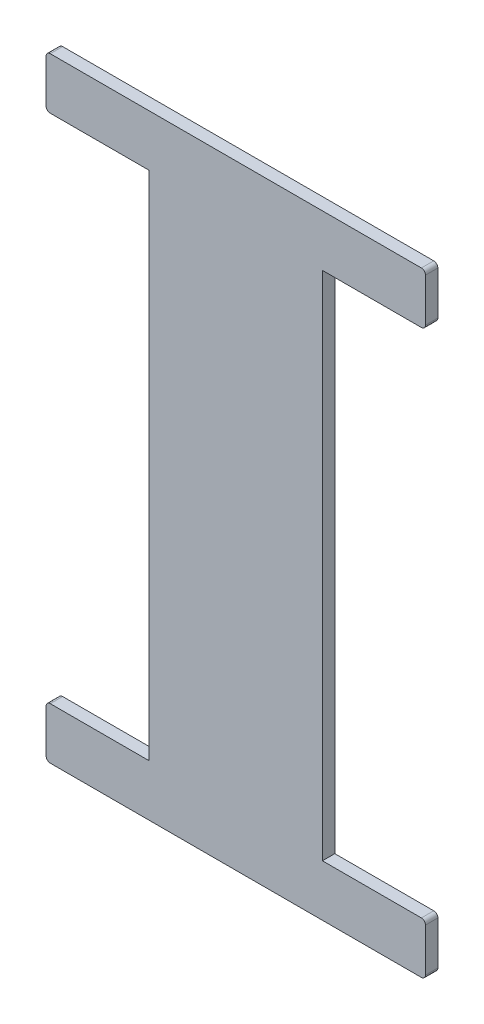
ISO-10303-21;
HEADER;
FILE_DESCRIPTION(('STEP AP214'),'2;1');
FILE_NAME('part.step','',(''),(''),'','','');
FILE_SCHEMA(('AUTOMOTIVE_DESIGN { 1 0 10303 214 1 1 1 1 }'));
ENDSEC;
DATA;
#1=APPLICATION_CONTEXT('core data for automotive mechanical design processes');
#2=APPLICATION_PROTOCOL_DEFINITION('international standard','automotive_design',2000,#1);
#3=PRODUCT_CONTEXT('',#1,'mechanical');
#4=PRODUCT('Part','Part','',(#3));
#5=PRODUCT_RELATED_PRODUCT_CATEGORY('part','',(#4));
#6=PRODUCT_DEFINITION_FORMATION('','',#4);
#7=PRODUCT_DEFINITION_CONTEXT('part definition',#1,'design');
#8=PRODUCT_DEFINITION('design','',#6,#7);
#9=PRODUCT_DEFINITION_SHAPE('','',#8);
#10=(LENGTH_UNIT() NAMED_UNIT(*) SI_UNIT(.MILLI.,.METRE.));
#11=(NAMED_UNIT(*) PLANE_ANGLE_UNIT() SI_UNIT($,.RADIAN.));
#12=(NAMED_UNIT(*) SI_UNIT($,.STERADIAN.) SOLID_ANGLE_UNIT());
#13=UNCERTAINTY_MEASURE_WITH_UNIT(LENGTH_MEASURE(1.E-05),#10,'distance_accuracy_value','');
#14=(GEOMETRIC_REPRESENTATION_CONTEXT(3) GLOBAL_UNCERTAINTY_ASSIGNED_CONTEXT((#13)) GLOBAL_UNIT_ASSIGNED_CONTEXT((#10,
#11,#12)) REPRESENTATION_CONTEXT('',''));
#15=CARTESIAN_POINT('',(0.,0.,0.));
#16=DIRECTION('',(0.,0.,1.));
#17=DIRECTION('',(1.,0.,0.));
#18=AXIS2_PLACEMENT_3D('',#15,#16,#17);
#19=CARTESIAN_POINT('',(21.,-74.5,3.));
#20=DIRECTION('',(-1.,0.,0.));
#21=DIRECTION('',(0.,0.,1.));
#22=AXIS2_PLACEMENT_3D('',#19,#20,#21);
#23=PLANE('',#22);
#24=DIRECTION('',(0.,1.,0.));
#25=VECTOR('',#24,1.);
#26=CARTESIAN_POINT('',(21.,-74.5,0.));
#27=LINE('',#26,#25);
#28=CARTESIAN_POINT('',(21.,-62.,0.));
#29=VERTEX_POINT('',#28);
#30=CARTESIAN_POINT('',(21.,62.,0.));
#31=VERTEX_POINT('',#30);
#32=EDGE_CURVE('E248',#29,#31,#27,.T.);
#33=ORIENTED_EDGE('',*,*,#32,.T.);
#34=DIRECTION('',(0.,0.,1.));
#35=VECTOR('',#34,1.);
#36=CARTESIAN_POINT('',(20.9999999999999,62.,-27.9508497187474));
#37=LINE('',#36,#35);
#38=CARTESIAN_POINT('',(21.,62.,3.));
#39=VERTEX_POINT('',#38);
#40=EDGE_CURVE('E357',#31,#39,#37,.T.);
#41=ORIENTED_EDGE('',*,*,#40,.T.);
#42=DIRECTION('',(0.,1.,0.));
#43=VECTOR('',#42,1.);
#44=CARTESIAN_POINT('',(21.,-74.5,3.));
#45=LINE('',#44,#43);
#46=CARTESIAN_POINT('',(21.,-62.,3.));
#47=VERTEX_POINT('',#46);
#48=EDGE_CURVE('E249',#47,#39,#45,.T.);
#49=ORIENTED_EDGE('',*,*,#48,.F.);
#50=DIRECTION('',(0.,0.,1.));
#51=VECTOR('',#50,1.);
#52=CARTESIAN_POINT('',(21.,-62.,-27.9508497187474));
#53=LINE('',#52,#51);
#54=EDGE_CURVE('E243',#29,#47,#53,.T.);
#55=ORIENTED_EDGE('',*,*,#54,.F.);
#56=EDGE_LOOP('',(#33,#41,#49,#55));
#57=FACE_BOUND('',#56,.T.);
#58=ADVANCED_FACE('F48',(#57),#23,.F.);
#59=CARTESIAN_POINT('',(-21.,74.5,3.));
#60=DIRECTION('',(0.,-1.,0.));
#61=DIRECTION('',(0.,0.,-1.));
#62=AXIS2_PLACEMENT_3D('',#59,#60,#61);
#63=PLANE('',#62);
#64=DIRECTION('',(-1.,0.,0.));
#65=VECTOR('',#64,1.);
#66=CARTESIAN_POINT('',(-21.,74.5,3.));
#67=LINE('',#66,#65);
#68=CARTESIAN_POINT('',(44.9999999999999,74.5,3.));
#69=VERTEX_POINT('',#68);
#70=CARTESIAN_POINT('',(-45.,74.5,3.));
#71=VERTEX_POINT('',#70);
#72=EDGE_CURVE('E252',#69,#71,#67,.T.);
#73=ORIENTED_EDGE('',*,*,#72,.F.);
#74=DIRECTION('',(0.,0.,1.));
#75=VECTOR('',#74,1.);
#76=CARTESIAN_POINT('',(44.9999999999999,74.5,0.));
#77=LINE('',#76,#75);
#78=CARTESIAN_POINT('',(44.9999999999999,74.5,0.));
#79=VERTEX_POINT('',#78);
#80=EDGE_CURVE('E288',#69,#79,#77,.F.);
#81=ORIENTED_EDGE('',*,*,#80,.T.);
#82=DIRECTION('',(-1.,0.,0.));
#83=VECTOR('',#82,1.);
#84=CARTESIAN_POINT('',(-21.,74.5,0.));
#85=LINE('',#84,#83);
#86=CARTESIAN_POINT('',(-45.,74.5,0.));
#87=VERTEX_POINT('',#86);
#88=EDGE_CURVE('E205',#79,#87,#85,.T.);
#89=ORIENTED_EDGE('',*,*,#88,.T.);
#90=DIRECTION('',(0.,0.,1.));
#91=VECTOR('',#90,1.);
#92=CARTESIAN_POINT('',(-45.,74.5,3.));
#93=LINE('',#92,#91);
#94=EDGE_CURVE('E285',#87,#71,#93,.T.);
#95=ORIENTED_EDGE('',*,*,#94,.T.);
#96=EDGE_LOOP('',(#73,#81,#89,#95));
#97=FACE_BOUND('',#96,.T.);
#98=ADVANCED_FACE('F340',(#97),#63,.F.);
#99=CARTESIAN_POINT('',(-21.,-74.5,3.));
#100=DIRECTION('',(1.,0.,0.));
#101=DIRECTION('',(0.,0.,-1.));
#102=AXIS2_PLACEMENT_3D('',#99,#100,#101);
#103=PLANE('',#102);
#104=DIRECTION('',(0.,-1.,0.));
#105=VECTOR('',#104,1.);
#106=CARTESIAN_POINT('',(-21.,-74.5,3.));
#107=LINE('',#106,#105);
#108=CARTESIAN_POINT('',(-21.,62.,3.));
#109=VERTEX_POINT('',#108);
#110=CARTESIAN_POINT('',(-21.,-62.,3.));
#111=VERTEX_POINT('',#110);
#112=EDGE_CURVE('E209',#109,#111,#107,.T.);
#113=ORIENTED_EDGE('',*,*,#112,.F.);
#114=DIRECTION('',(0.,0.,1.));
#115=VECTOR('',#114,1.);
#116=CARTESIAN_POINT('',(-21.,62.,-27.9508497187474));
#117=LINE('',#116,#115);
#118=CARTESIAN_POINT('',(-21.,62.,0.));
#119=VERTEX_POINT('',#118);
#120=EDGE_CURVE('E191',#119,#109,#117,.T.);
#121=ORIENTED_EDGE('',*,*,#120,.F.);
#122=DIRECTION('',(0.,-1.,0.));
#123=VECTOR('',#122,1.);
#124=CARTESIAN_POINT('',(-21.,-74.5,0.));
#125=LINE('',#124,#123);
#126=CARTESIAN_POINT('',(-21.,-62.,0.));
#127=VERTEX_POINT('',#126);
#128=EDGE_CURVE('E196',#119,#127,#125,.T.);
#129=ORIENTED_EDGE('',*,*,#128,.T.);
#130=DIRECTION('',(0.,0.,1.));
#131=VECTOR('',#130,1.);
#132=CARTESIAN_POINT('',(-21.,-62.,-27.9508497187474));
#133=LINE('',#132,#131);
#134=EDGE_CURVE('E224',#127,#111,#133,.T.);
#135=ORIENTED_EDGE('',*,*,#134,.T.);
#136=EDGE_LOOP('',(#113,#121,#129,#135));
#137=FACE_BOUND('',#136,.T.);
#138=ADVANCED_FACE('F208',(#137),#103,.F.);
#139=CARTESIAN_POINT('',(-21.,-74.5,3.));
#140=DIRECTION('',(0.,1.,0.));
#141=DIRECTION('',(0.,0.,1.));
#142=AXIS2_PLACEMENT_3D('',#139,#140,#141);
#143=PLANE('',#142);
#144=DIRECTION('',(1.,0.,0.));
#145=VECTOR('',#144,1.);
#146=CARTESIAN_POINT('',(-21.,-74.5,0.));
#147=LINE('',#146,#145);
#148=CARTESIAN_POINT('',(-45.,-74.5,0.));
#149=VERTEX_POINT('',#148);
#150=CARTESIAN_POINT('',(45.,-74.5,0.));
#151=VERTEX_POINT('',#150);
#152=EDGE_CURVE('E204',#149,#151,#147,.T.);
#153=ORIENTED_EDGE('',*,*,#152,.T.);
#154=DIRECTION('',(0.,0.,1.));
#155=VECTOR('',#154,1.);
#156=CARTESIAN_POINT('',(45.,-74.5,3.));
#157=LINE('',#156,#155);
#158=CARTESIAN_POINT('',(45.,-74.5,3.));
#159=VERTEX_POINT('',#158);
#160=EDGE_CURVE('E316',#151,#159,#157,.T.);
#161=ORIENTED_EDGE('',*,*,#160,.T.);
#162=DIRECTION('',(1.,0.,0.));
#163=VECTOR('',#162,1.);
#164=CARTESIAN_POINT('',(-21.,-74.5,3.));
#165=LINE('',#164,#163);
#166=CARTESIAN_POINT('',(-45.,-74.5,3.));
#167=VERTEX_POINT('',#166);
#168=EDGE_CURVE('E256',#167,#159,#165,.T.);
#169=ORIENTED_EDGE('',*,*,#168,.F.);
#170=DIRECTION('',(0.,0.,1.));
#171=VECTOR('',#170,1.);
#172=CARTESIAN_POINT('',(-45.,-74.5,0.));
#173=LINE('',#172,#171);
#174=EDGE_CURVE('E314',#167,#149,#173,.F.);
#175=ORIENTED_EDGE('',*,*,#174,.T.);
#176=EDGE_LOOP('',(#153,#161,#169,#175));
#177=FACE_BOUND('',#176,.T.);
#178=ADVANCED_FACE('F392',(#177),#143,.F.);
#179=CARTESIAN_POINT('',(0.,0.,3.));
#180=DIRECTION('',(0.,0.,-1.));
#181=DIRECTION('',(-1.,0.,0.));
#182=AXIS2_PLACEMENT_3D('',#179,#180,#181);
#183=PLANE('',#182);
#184=DIRECTION('',(0.,1.,0.));
#185=VECTOR('',#184,1.);
#186=CARTESIAN_POINT('',(45.9999999999999,74.5,3.));
#187=LINE('',#186,#185);
#188=CARTESIAN_POINT('',(45.9999999999999,63.,3.));
#189=VERTEX_POINT('',#188);
#190=CARTESIAN_POINT('',(45.9999999999999,73.5,3.));
#191=VERTEX_POINT('',#190);
#192=EDGE_CURVE('E213',#189,#191,#187,.T.);
#193=ORIENTED_EDGE('',*,*,#192,.T.);
#194=CARTESIAN_POINT('',(44.9999999999999,73.5,3.));
#195=DIRECTION('',(0.,0.,-1.));
#196=DIRECTION('',(-1.,0.,0.));
#197=AXIS2_PLACEMENT_3D('',#194,#195,#196);
#198=CIRCLE('',#197,1.);
#199=EDGE_CURVE('E283',#191,#69,#198,.F.);
#200=ORIENTED_EDGE('',*,*,#199,.T.);
#201=ORIENTED_EDGE('',*,*,#72,.T.);
#202=CARTESIAN_POINT('',(-45.,73.5,3.));
#203=DIRECTION('',(0.,0.,-1.));
#204=DIRECTION('',(-1.,0.,0.));
#205=AXIS2_PLACEMENT_3D('',#202,#203,#204);
#206=CIRCLE('',#205,1.);
#207=CARTESIAN_POINT('',(-46.,73.5,3.));
#208=VERTEX_POINT('',#207);
#209=EDGE_CURVE('E271',#71,#208,#206,.F.);
#210=ORIENTED_EDGE('',*,*,#209,.T.);
#211=DIRECTION('',(0.,-1.,0.));
#212=VECTOR('',#211,1.);
#213=CARTESIAN_POINT('',(-46.,74.5,3.));
#214=LINE('',#213,#212);
#215=CARTESIAN_POINT('',(-46.,63.,3.));
#216=VERTEX_POINT('',#215);
#217=EDGE_CURVE('E219',#208,#216,#214,.T.);
#218=ORIENTED_EDGE('',*,*,#217,.T.);
#219=CARTESIAN_POINT('',(-45.,63.,3.));
#220=DIRECTION('',(0.,0.,-1.));
#221=DIRECTION('',(-1.,0.,0.));
#222=AXIS2_PLACEMENT_3D('',#219,#220,#221);
#223=CIRCLE('',#222,1.);
#224=CARTESIAN_POINT('',(-45.,62.,3.));
#225=VERTEX_POINT('',#224);
#226=EDGE_CURVE('E269',#216,#225,#223,.F.);
#227=ORIENTED_EDGE('',*,*,#226,.T.);
#228=DIRECTION('',(1.,0.,0.));
#229=VECTOR('',#228,1.);
#230=CARTESIAN_POINT('',(-21.,62.,3.));
#231=LINE('',#230,#229);
#232=EDGE_CURVE('E217',#225,#109,#231,.T.);
#233=ORIENTED_EDGE('',*,*,#232,.T.);
#234=ORIENTED_EDGE('',*,*,#112,.T.);
#235=DIRECTION('',(-1.,0.,0.));
#236=VECTOR('',#235,1.);
#237=CARTESIAN_POINT('',(-21.,-62.,3.));
#238=LINE('',#237,#236);
#239=CARTESIAN_POINT('',(-45.,-62.,3.));
#240=VERTEX_POINT('',#239);
#241=EDGE_CURVE('E230',#111,#240,#238,.T.);
#242=ORIENTED_EDGE('',*,*,#241,.T.);
#243=CARTESIAN_POINT('',(-45.,-63.,3.));
#244=DIRECTION('',(0.,0.,-1.));
#245=DIRECTION('',(-1.,0.,0.));
#246=AXIS2_PLACEMENT_3D('',#243,#244,#245);
#247=CIRCLE('',#246,1.);
#248=CARTESIAN_POINT('',(-46.,-63.,3.));
#249=VERTEX_POINT('',#248);
#250=EDGE_CURVE('E273',#240,#249,#247,.F.);
#251=ORIENTED_EDGE('',*,*,#250,.T.);
#252=DIRECTION('',(0.,-1.,0.));
#253=VECTOR('',#252,1.);
#254=CARTESIAN_POINT('',(-46.,-74.5,3.));
#255=LINE('',#254,#253);
#256=CARTESIAN_POINT('',(-46.,-73.5,3.));
#257=VERTEX_POINT('',#256);
#258=EDGE_CURVE('E226',#249,#257,#255,.T.);
#259=ORIENTED_EDGE('',*,*,#258,.T.);
#260=CARTESIAN_POINT('',(-45.,-73.5,3.));
#261=DIRECTION('',(0.,0.,-1.));
#262=DIRECTION('',(-1.,0.,0.));
#263=AXIS2_PLACEMENT_3D('',#260,#261,#262);
#264=CIRCLE('',#263,1.);
#265=EDGE_CURVE('E275',#257,#167,#264,.F.);
#266=ORIENTED_EDGE('',*,*,#265,.T.);
#267=ORIENTED_EDGE('',*,*,#168,.T.);
#268=CARTESIAN_POINT('',(45.,-73.5,3.));
#269=DIRECTION('',(0.,0.,-1.));
#270=DIRECTION('',(-1.,0.,0.));
#271=AXIS2_PLACEMENT_3D('',#268,#269,#270);
#272=CIRCLE('',#271,1.);
#273=CARTESIAN_POINT('',(46.,-73.5,3.));
#274=VERTEX_POINT('',#273);
#275=EDGE_CURVE('E277',#159,#274,#272,.F.);
#276=ORIENTED_EDGE('',*,*,#275,.T.);
#277=DIRECTION('',(0.,1.,0.));
#278=VECTOR('',#277,1.);
#279=CARTESIAN_POINT('',(46.,-74.5,3.));
#280=LINE('',#279,#278);
#281=CARTESIAN_POINT('',(46.,-63.,3.));
#282=VERTEX_POINT('',#281);
#283=EDGE_CURVE('E233',#274,#282,#280,.T.);
#284=ORIENTED_EDGE('',*,*,#283,.T.);
#285=CARTESIAN_POINT('',(45.,-63.,3.));
#286=DIRECTION('',(0.,0.,-1.));
#287=DIRECTION('',(-1.,0.,0.));
#288=AXIS2_PLACEMENT_3D('',#285,#286,#287);
#289=CIRCLE('',#288,1.);
#290=CARTESIAN_POINT('',(45.,-62.,3.));
#291=VERTEX_POINT('',#290);
#292=EDGE_CURVE('E279',#282,#291,#289,.F.);
#293=ORIENTED_EDGE('',*,*,#292,.T.);
#294=DIRECTION('',(-1.,0.,0.));
#295=VECTOR('',#294,1.);
#296=CARTESIAN_POINT('',(21.,-62.,3.));
#297=LINE('',#296,#295);
#298=EDGE_CURVE('E236',#291,#47,#297,.T.);
#299=ORIENTED_EDGE('',*,*,#298,.T.);
#300=ORIENTED_EDGE('',*,*,#48,.T.);
#301=DIRECTION('',(1.,0.,0.));
#302=VECTOR('',#301,1.);
#303=CARTESIAN_POINT('',(20.9999999999999,62.,3.));
#304=LINE('',#303,#302);
#305=CARTESIAN_POINT('',(44.9999999999999,62.,3.));
#306=VERTEX_POINT('',#305);
#307=EDGE_CURVE('E210',#39,#306,#304,.T.);
#308=ORIENTED_EDGE('',*,*,#307,.T.);
#309=CARTESIAN_POINT('',(44.9999999999999,63.,3.));
#310=DIRECTION('',(0.,0.,-1.));
#311=DIRECTION('',(-1.,0.,0.));
#312=AXIS2_PLACEMENT_3D('',#309,#310,#311);
#313=CIRCLE('',#312,1.);
#314=EDGE_CURVE('E281',#306,#189,#313,.F.);
#315=ORIENTED_EDGE('',*,*,#314,.T.);
#316=EDGE_LOOP('',(#193,#200,#201,#210,#218,#227,#233,#234,#242,#251,#259,#266,#267,#276,#284,
#293,#299,#300,#308,#315));
#317=FACE_BOUND('',#316,.T.);
#318=ADVANCED_FACE('F344',(#317),#183,.F.);
#319=CARTESIAN_POINT('',(0.,0.,0.));
#320=DIRECTION('',(0.,0.,-1.));
#321=DIRECTION('',(-1.,0.,0.));
#322=AXIS2_PLACEMENT_3D('',#319,#320,#321);
#323=PLANE('',#322);
#324=ORIENTED_EDGE('',*,*,#88,.F.);
#325=CARTESIAN_POINT('',(44.9999999999999,73.5,0.));
#326=DIRECTION('',(0.,0.,-1.));
#327=DIRECTION('',(-1.,0.,0.));
#328=AXIS2_PLACEMENT_3D('',#325,#326,#327);
#329=CIRCLE('',#328,1.);
#330=CARTESIAN_POINT('',(45.9999999999999,73.5,0.));
#331=VERTEX_POINT('',#330);
#332=EDGE_CURVE('E302',#79,#331,#329,.T.);
#333=ORIENTED_EDGE('',*,*,#332,.T.);
#334=DIRECTION('',(0.,1.,0.));
#335=VECTOR('',#334,1.);
#336=CARTESIAN_POINT('',(45.9999999999999,74.5,0.));
#337=LINE('',#336,#335);
#338=CARTESIAN_POINT('',(45.9999999999999,63.,0.));
#339=VERTEX_POINT('',#338);
#340=EDGE_CURVE('E354',#339,#331,#337,.T.);
#341=ORIENTED_EDGE('',*,*,#340,.F.);
#342=CARTESIAN_POINT('',(44.9999999999999,63.,0.));
#343=DIRECTION('',(0.,0.,-1.));
#344=DIRECTION('',(-1.,0.,0.));
#345=AXIS2_PLACEMENT_3D('',#342,#343,#344);
#346=CIRCLE('',#345,1.);
#347=CARTESIAN_POINT('',(44.9999999999999,62.,0.));
#348=VERTEX_POINT('',#347);
#349=EDGE_CURVE('E63',#339,#348,#346,.T.);
#350=ORIENTED_EDGE('',*,*,#349,.T.);
#351=DIRECTION('',(1.,0.,0.));
#352=VECTOR('',#351,1.);
#353=CARTESIAN_POINT('',(20.9999999999999,62.,0.));
#354=LINE('',#353,#352);
#355=EDGE_CURVE('E355',#31,#348,#354,.T.);
#356=ORIENTED_EDGE('',*,*,#355,.F.);
#357=ORIENTED_EDGE('',*,*,#32,.F.);
#358=DIRECTION('',(-1.,0.,0.));
#359=VECTOR('',#358,1.);
#360=CARTESIAN_POINT('',(21.,-62.,0.));
#361=LINE('',#360,#359);
#362=CARTESIAN_POINT('',(45.,-62.,0.));
#363=VERTEX_POINT('',#362);
#364=EDGE_CURVE('E241',#363,#29,#361,.T.);
#365=ORIENTED_EDGE('',*,*,#364,.F.);
#366=CARTESIAN_POINT('',(45.,-63.,0.));
#367=DIRECTION('',(0.,0.,-1.));
#368=DIRECTION('',(-1.,0.,0.));
#369=AXIS2_PLACEMENT_3D('',#366,#367,#368);
#370=CIRCLE('',#369,1.);
#371=CARTESIAN_POINT('',(46.,-63.,0.));
#372=VERTEX_POINT('',#371);
#373=EDGE_CURVE('E299',#363,#372,#370,.T.);
#374=ORIENTED_EDGE('',*,*,#373,.T.);
#375=DIRECTION('',(0.,1.,0.));
#376=VECTOR('',#375,1.);
#377=CARTESIAN_POINT('',(46.,-74.5,0.));
#378=LINE('',#377,#376);
#379=CARTESIAN_POINT('',(46.,-73.5,0.));
#380=VERTEX_POINT('',#379);
#381=EDGE_CURVE('E238',#380,#372,#378,.T.);
#382=ORIENTED_EDGE('',*,*,#381,.F.);
#383=CARTESIAN_POINT('',(45.,-73.5,0.));
#384=DIRECTION('',(0.,0.,-1.));
#385=DIRECTION('',(-1.,0.,0.));
#386=AXIS2_PLACEMENT_3D('',#383,#384,#385);
#387=CIRCLE('',#386,1.);
#388=EDGE_CURVE('E297',#380,#151,#387,.T.);
#389=ORIENTED_EDGE('',*,*,#388,.T.);
#390=ORIENTED_EDGE('',*,*,#152,.F.);
#391=CARTESIAN_POINT('',(-45.,-73.5,0.));
#392=DIRECTION('',(0.,0.,-1.));
#393=DIRECTION('',(-1.,0.,0.));
#394=AXIS2_PLACEMENT_3D('',#391,#392,#393);
#395=CIRCLE('',#394,1.);
#396=CARTESIAN_POINT('',(-46.,-73.5,0.));
#397=VERTEX_POINT('',#396);
#398=EDGE_CURVE('E295',#149,#397,#395,.T.);
#399=ORIENTED_EDGE('',*,*,#398,.T.);
#400=DIRECTION('',(0.,-1.,0.));
#401=VECTOR('',#400,1.);
#402=CARTESIAN_POINT('',(-46.,-74.5,0.));
#403=LINE('',#402,#401);
#404=CARTESIAN_POINT('',(-46.,-63.,0.));
#405=VERTEX_POINT('',#404);
#406=EDGE_CURVE('E222',#405,#397,#403,.T.);
#407=ORIENTED_EDGE('',*,*,#406,.F.);
#408=CARTESIAN_POINT('',(-45.,-63.,0.));
#409=DIRECTION('',(0.,0.,-1.));
#410=DIRECTION('',(-1.,0.,0.));
#411=AXIS2_PLACEMENT_3D('',#408,#409,#410);
#412=CIRCLE('',#411,1.);
#413=CARTESIAN_POINT('',(-45.,-62.,0.));
#414=VERTEX_POINT('',#413);
#415=EDGE_CURVE('E293',#405,#414,#412,.T.);
#416=ORIENTED_EDGE('',*,*,#415,.T.);
#417=DIRECTION('',(-1.,0.,0.));
#418=VECTOR('',#417,1.);
#419=CARTESIAN_POINT('',(-21.,-62.,0.));
#420=LINE('',#419,#418);
#421=EDGE_CURVE('E200',#127,#414,#420,.T.);
#422=ORIENTED_EDGE('',*,*,#421,.F.);
#423=ORIENTED_EDGE('',*,*,#128,.F.);
#424=DIRECTION('',(1.,0.,0.));
#425=VECTOR('',#424,1.);
#426=CARTESIAN_POINT('',(-21.,62.,0.));
#427=LINE('',#426,#425);
#428=CARTESIAN_POINT('',(-45.,62.,0.));
#429=VERTEX_POINT('',#428);
#430=EDGE_CURVE('E186',#429,#119,#427,.T.);
#431=ORIENTED_EDGE('',*,*,#430,.F.);
#432=CARTESIAN_POINT('',(-45.,63.,0.));
#433=DIRECTION('',(0.,0.,-1.));
#434=DIRECTION('',(-1.,0.,0.));
#435=AXIS2_PLACEMENT_3D('',#432,#433,#434);
#436=CIRCLE('',#435,1.);
#437=CARTESIAN_POINT('',(-46.,63.,0.));
#438=VERTEX_POINT('',#437);
#439=EDGE_CURVE('E70',#429,#438,#436,.T.);
#440=ORIENTED_EDGE('',*,*,#439,.T.);
#441=DIRECTION('',(0.,-1.,0.));
#442=VECTOR('',#441,1.);
#443=CARTESIAN_POINT('',(-46.,74.5,0.));
#444=LINE('',#443,#442);
#445=CARTESIAN_POINT('',(-46.,73.5,0.));
#446=VERTEX_POINT('',#445);
#447=EDGE_CURVE('E193',#446,#438,#444,.T.);
#448=ORIENTED_EDGE('',*,*,#447,.F.);
#449=CARTESIAN_POINT('',(-45.,73.5,0.));
#450=DIRECTION('',(0.,0.,-1.));
#451=DIRECTION('',(-1.,0.,0.));
#452=AXIS2_PLACEMENT_3D('',#449,#450,#451);
#453=CIRCLE('',#452,1.);
#454=EDGE_CURVE('E291',#446,#87,#453,.T.);
#455=ORIENTED_EDGE('',*,*,#454,.T.);
#456=EDGE_LOOP('',(#324,#333,#341,#350,#356,#357,#365,#374,#382,#389,#390,#399,#407,#416,#422,
#423,#431,#440,#448,#455));
#457=FACE_BOUND('',#456,.T.);
#458=ADVANCED_FACE('F198',(#457),#323,.T.);
#459=CARTESIAN_POINT('',(46.,-74.5,-27.9508497187474));
#460=DIRECTION('',(1.,0.,0.));
#461=DIRECTION('',(0.,0.,-1.));
#462=AXIS2_PLACEMENT_3D('',#459,#460,#461);
#463=PLANE('',#462);
#464=ORIENTED_EDGE('',*,*,#381,.T.);
#465=DIRECTION('',(0.,0.,1.));
#466=VECTOR('',#465,1.);
#467=CARTESIAN_POINT('',(46.,-63.,-27.9508497187474));
#468=LINE('',#467,#466);
#469=EDGE_CURVE('E309',#372,#282,#468,.T.);
#470=ORIENTED_EDGE('',*,*,#469,.T.);
#471=ORIENTED_EDGE('',*,*,#283,.F.);
#472=DIRECTION('',(0.,0.,1.));
#473=VECTOR('',#472,1.);
#474=CARTESIAN_POINT('',(46.,-73.5,0.));
#475=LINE('',#474,#473);
#476=EDGE_CURVE('E307',#274,#380,#475,.F.);
#477=ORIENTED_EDGE('',*,*,#476,.T.);
#478=EDGE_LOOP('',(#464,#470,#471,#477));
#479=FACE_BOUND('',#478,.T.);
#480=ADVANCED_FACE('F398',(#479),#463,.T.);
#481=CARTESIAN_POINT('',(21.,-62.,-27.9508497187474));
#482=DIRECTION('',(0.,1.,0.));
#483=DIRECTION('',(0.,0.,1.));
#484=AXIS2_PLACEMENT_3D('',#481,#482,#483);
#485=PLANE('',#484);
#486=ORIENTED_EDGE('',*,*,#298,.F.);
#487=DIRECTION('',(0.,0.,1.));
#488=VECTOR('',#487,1.);
#489=CARTESIAN_POINT('',(45.,-62.,-27.9508497187474));
#490=LINE('',#489,#488);
#491=EDGE_CURVE('E312',#291,#363,#490,.F.);
#492=ORIENTED_EDGE('',*,*,#491,.T.);
#493=ORIENTED_EDGE('',*,*,#364,.T.);
#494=ORIENTED_EDGE('',*,*,#54,.T.);
#495=EDGE_LOOP('',(#486,#492,#493,#494));
#496=FACE_BOUND('',#495,.T.);
#497=ADVANCED_FACE('F403',(#496),#485,.T.);
#498=CARTESIAN_POINT('',(-21.,-62.,-27.9508497187474));
#499=DIRECTION('',(0.,1.,0.));
#500=DIRECTION('',(0.,0.,1.));
#501=AXIS2_PLACEMENT_3D('',#498,#499,#500);
#502=PLANE('',#501);
#503=ORIENTED_EDGE('',*,*,#421,.T.);
#504=DIRECTION('',(0.,0.,1.));
#505=VECTOR('',#504,1.);
#506=CARTESIAN_POINT('',(-45.,-62.,-27.9508497187474));
#507=LINE('',#506,#505);
#508=EDGE_CURVE('E324',#414,#240,#507,.T.);
#509=ORIENTED_EDGE('',*,*,#508,.T.);
#510=ORIENTED_EDGE('',*,*,#241,.F.);
#511=ORIENTED_EDGE('',*,*,#134,.F.);
#512=EDGE_LOOP('',(#503,#509,#510,#511));
#513=FACE_BOUND('',#512,.T.);
#514=ADVANCED_FACE('F407',(#513),#502,.T.);
#515=CARTESIAN_POINT('',(-46.,-74.5,-27.9508497187474));
#516=DIRECTION('',(-1.,0.,0.));
#517=DIRECTION('',(0.,0.,1.));
#518=AXIS2_PLACEMENT_3D('',#515,#516,#517);
#519=PLANE('',#518);
#520=ORIENTED_EDGE('',*,*,#406,.T.);
#521=DIRECTION('',(0.,0.,1.));
#522=VECTOR('',#521,1.);
#523=CARTESIAN_POINT('',(-46.,-73.5,3.));
#524=LINE('',#523,#522);
#525=EDGE_CURVE('E321',#397,#257,#524,.T.);
#526=ORIENTED_EDGE('',*,*,#525,.T.);
#527=ORIENTED_EDGE('',*,*,#258,.F.);
#528=DIRECTION('',(0.,0.,1.));
#529=VECTOR('',#528,1.);
#530=CARTESIAN_POINT('',(-46.,-63.,-27.9508497187474));
#531=LINE('',#530,#529);
#532=EDGE_CURVE('E319',#249,#405,#531,.F.);
#533=ORIENTED_EDGE('',*,*,#532,.T.);
#534=EDGE_LOOP('',(#520,#526,#527,#533));
#535=FACE_BOUND('',#534,.T.);
#536=ADVANCED_FACE('F409',(#535),#519,.T.);
#537=CARTESIAN_POINT('',(-46.,74.5,-27.9508497187474));
#538=DIRECTION('',(-1.,0.,0.));
#539=DIRECTION('',(0.,0.,1.));
#540=AXIS2_PLACEMENT_3D('',#537,#538,#539);
#541=PLANE('',#540);
#542=ORIENTED_EDGE('',*,*,#217,.F.);
#543=DIRECTION('',(0.,0.,1.));
#544=VECTOR('',#543,1.);
#545=CARTESIAN_POINT('',(-46.,73.5,0.));
#546=LINE('',#545,#544);
#547=EDGE_CURVE('E56',#208,#446,#546,.F.);
#548=ORIENTED_EDGE('',*,*,#547,.T.);
#549=ORIENTED_EDGE('',*,*,#447,.T.);
#550=DIRECTION('',(0.,0.,1.));
#551=VECTOR('',#550,1.);
#552=CARTESIAN_POINT('',(-46.,63.,-27.9508497187474));
#553=LINE('',#552,#551);
#554=EDGE_CURVE('E327',#438,#216,#553,.T.);
#555=ORIENTED_EDGE('',*,*,#554,.T.);
#556=EDGE_LOOP('',(#542,#548,#549,#555));
#557=FACE_BOUND('',#556,.T.);
#558=ADVANCED_FACE('F332',(#557),#541,.T.);
#559=CARTESIAN_POINT('',(-21.,62.,-27.9508497187474));
#560=DIRECTION('',(0.,-1.,0.));
#561=DIRECTION('',(0.,0.,-1.));
#562=AXIS2_PLACEMENT_3D('',#559,#560,#561);
#563=PLANE('',#562);
#564=ORIENTED_EDGE('',*,*,#232,.F.);
#565=DIRECTION('',(0.,0.,1.));
#566=VECTOR('',#565,1.);
#567=CARTESIAN_POINT('',(-45.,62.,-27.9508497187474));
#568=LINE('',#567,#566);
#569=EDGE_CURVE('E11',#225,#429,#568,.F.);
#570=ORIENTED_EDGE('',*,*,#569,.T.);
#571=ORIENTED_EDGE('',*,*,#430,.T.);
#572=ORIENTED_EDGE('',*,*,#120,.T.);
#573=EDGE_LOOP('',(#564,#570,#571,#572));
#574=FACE_BOUND('',#573,.T.);
#575=ADVANCED_FACE('F189',(#574),#563,.T.);
#576=CARTESIAN_POINT('',(20.9999999999999,62.,-27.9508497187474));
#577=DIRECTION('',(0.,-1.,0.));
#578=DIRECTION('',(0.,0.,-1.));
#579=AXIS2_PLACEMENT_3D('',#576,#577,#578);
#580=PLANE('',#579);
#581=ORIENTED_EDGE('',*,*,#355,.T.);
#582=DIRECTION('',(0.,0.,1.));
#583=VECTOR('',#582,1.);
#584=CARTESIAN_POINT('',(44.9999999999999,62.,-27.9508497187474));
#585=LINE('',#584,#583);
#586=EDGE_CURVE('E304',#348,#306,#585,.T.);
#587=ORIENTED_EDGE('',*,*,#586,.T.);
#588=ORIENTED_EDGE('',*,*,#307,.F.);
#589=ORIENTED_EDGE('',*,*,#40,.F.);
#590=EDGE_LOOP('',(#581,#587,#588,#589));
#591=FACE_BOUND('',#590,.T.);
#592=ADVANCED_FACE('F368',(#591),#580,.T.);
#593=CARTESIAN_POINT('',(45.9999999999999,74.5,-27.9508497187474));
#594=DIRECTION('',(1.,0.,0.));
#595=DIRECTION('',(0.,0.,-1.));
#596=AXIS2_PLACEMENT_3D('',#593,#594,#595);
#597=PLANE('',#596);
#598=ORIENTED_EDGE('',*,*,#340,.T.);
#599=DIRECTION('',(0.,0.,1.));
#600=VECTOR('',#599,1.);
#601=CARTESIAN_POINT('',(45.9999999999999,73.5,3.));
#602=LINE('',#601,#600);
#603=EDGE_CURVE('E266',#331,#191,#602,.T.);
#604=ORIENTED_EDGE('',*,*,#603,.T.);
#605=ORIENTED_EDGE('',*,*,#192,.F.);
#606=DIRECTION('',(0.,0.,1.));
#607=VECTOR('',#606,1.);
#608=CARTESIAN_POINT('',(45.9999999999999,63.,-27.9508497187474));
#609=LINE('',#608,#607);
#610=EDGE_CURVE('E259',#189,#339,#609,.F.);
#611=ORIENTED_EDGE('',*,*,#610,.T.);
#612=EDGE_LOOP('',(#598,#604,#605,#611));
#613=FACE_BOUND('',#612,.T.);
#614=ADVANCED_FACE('F352',(#613),#597,.T.);
#615=CARTESIAN_POINT('',(44.9999999999999,73.5,-27.9508497187474));
#616=DIRECTION('',(0.,0.,-1.));
#617=DIRECTION('',(-1.,0.,0.));
#618=AXIS2_PLACEMENT_3D('',#615,#616,#617);
#619=CYLINDRICAL_SURFACE('',#618,1.);
#620=ORIENTED_EDGE('',*,*,#332,.F.);
#621=ORIENTED_EDGE('',*,*,#80,.F.);
#622=ORIENTED_EDGE('',*,*,#199,.F.);
#623=ORIENTED_EDGE('',*,*,#603,.F.);
#624=EDGE_LOOP('',(#620,#621,#622,#623));
#625=FACE_BOUND('',#624,.T.);
#626=ADVANCED_FACE('F349',(#625),#619,.T.);
#627=CARTESIAN_POINT('',(44.9999999999999,63.,-27.9508497187474));
#628=DIRECTION('',(0.,0.,1.));
#629=DIRECTION('',(1.,0.,0.));
#630=AXIS2_PLACEMENT_3D('',#627,#628,#629);
#631=CYLINDRICAL_SURFACE('',#630,1.);
#632=ORIENTED_EDGE('',*,*,#349,.F.);
#633=ORIENTED_EDGE('',*,*,#610,.F.);
#634=ORIENTED_EDGE('',*,*,#314,.F.);
#635=ORIENTED_EDGE('',*,*,#586,.F.);
#636=EDGE_LOOP('',(#632,#633,#634,#635));
#637=FACE_BOUND('',#636,.T.);
#638=ADVANCED_FACE('F371',(#637),#631,.T.);
#639=CARTESIAN_POINT('',(45.,-63.,-27.9508497187474));
#640=DIRECTION('',(0.,0.,1.));
#641=DIRECTION('',(1.,0.,0.));
#642=AXIS2_PLACEMENT_3D('',#639,#640,#641);
#643=CYLINDRICAL_SURFACE('',#642,1.);
#644=ORIENTED_EDGE('',*,*,#373,.F.);
#645=ORIENTED_EDGE('',*,*,#491,.F.);
#646=ORIENTED_EDGE('',*,*,#292,.F.);
#647=ORIENTED_EDGE('',*,*,#469,.F.);
#648=EDGE_LOOP('',(#644,#645,#646,#647));
#649=FACE_BOUND('',#648,.T.);
#650=ADVANCED_FACE('F373',(#649),#643,.T.);
#651=CARTESIAN_POINT('',(45.,-73.5,3.));
#652=DIRECTION('',(0.,0.,-1.));
#653=DIRECTION('',(-1.,0.,0.));
#654=AXIS2_PLACEMENT_3D('',#651,#652,#653);
#655=CYLINDRICAL_SURFACE('',#654,1.);
#656=ORIENTED_EDGE('',*,*,#388,.F.);
#657=ORIENTED_EDGE('',*,*,#476,.F.);
#658=ORIENTED_EDGE('',*,*,#275,.F.);
#659=ORIENTED_EDGE('',*,*,#160,.F.);
#660=EDGE_LOOP('',(#656,#657,#658,#659));
#661=FACE_BOUND('',#660,.T.);
#662=ADVANCED_FACE('F379',(#661),#655,.T.);
#663=CARTESIAN_POINT('',(-45.,-73.5,-27.9508497187474));
#664=DIRECTION('',(0.,0.,-1.));
#665=DIRECTION('',(-1.,0.,0.));
#666=AXIS2_PLACEMENT_3D('',#663,#664,#665);
#667=CYLINDRICAL_SURFACE('',#666,1.);
#668=ORIENTED_EDGE('',*,*,#398,.F.);
#669=ORIENTED_EDGE('',*,*,#174,.F.);
#670=ORIENTED_EDGE('',*,*,#265,.F.);
#671=ORIENTED_EDGE('',*,*,#525,.F.);
#672=EDGE_LOOP('',(#668,#669,#670,#671));
#673=FACE_BOUND('',#672,.T.);
#674=ADVANCED_FACE('F457',(#673),#667,.T.);
#675=CARTESIAN_POINT('',(-45.,-63.,-27.9508497187474));
#676=DIRECTION('',(0.,0.,1.));
#677=DIRECTION('',(1.,0.,0.));
#678=AXIS2_PLACEMENT_3D('',#675,#676,#677);
#679=CYLINDRICAL_SURFACE('',#678,1.);
#680=ORIENTED_EDGE('',*,*,#415,.F.);
#681=ORIENTED_EDGE('',*,*,#532,.F.);
#682=ORIENTED_EDGE('',*,*,#250,.F.);
#683=ORIENTED_EDGE('',*,*,#508,.F.);
#684=EDGE_LOOP('',(#680,#681,#682,#683));
#685=FACE_BOUND('',#684,.T.);
#686=ADVANCED_FACE('F468',(#685),#679,.T.);
#687=CARTESIAN_POINT('',(-45.,73.5,3.));
#688=DIRECTION('',(0.,0.,-1.));
#689=DIRECTION('',(-1.,0.,0.));
#690=AXIS2_PLACEMENT_3D('',#687,#688,#689);
#691=CYLINDRICAL_SURFACE('',#690,1.);
#692=ORIENTED_EDGE('',*,*,#454,.F.);
#693=ORIENTED_EDGE('',*,*,#547,.F.);
#694=ORIENTED_EDGE('',*,*,#209,.F.);
#695=ORIENTED_EDGE('',*,*,#94,.F.);
#696=EDGE_LOOP('',(#692,#693,#694,#695));
#697=FACE_BOUND('',#696,.T.);
#698=ADVANCED_FACE('F337',(#697),#691,.T.);
#699=CARTESIAN_POINT('',(-45.,63.,-27.9508497187474));
#700=DIRECTION('',(0.,0.,1.));
#701=DIRECTION('',(1.,0.,0.));
#702=AXIS2_PLACEMENT_3D('',#699,#700,#701);
#703=CYLINDRICAL_SURFACE('',#702,1.);
#704=ORIENTED_EDGE('',*,*,#439,.F.);
#705=ORIENTED_EDGE('',*,*,#569,.F.);
#706=ORIENTED_EDGE('',*,*,#226,.F.);
#707=ORIENTED_EDGE('',*,*,#554,.F.);
#708=EDGE_LOOP('',(#704,#705,#706,#707));
#709=FACE_BOUND('',#708,.T.);
#710=ADVANCED_FACE('F50',(#709),#703,.T.);
#711=CLOSED_SHELL('',(#58,#98,#138,#178,#318,#458,#480,#497,#514,#536,#558,#575,#592,#614,#626,
#638,#650,#662,#674,#686,#698,#710));
#712=MANIFOLD_SOLID_BREP('B2',#711);
#713=ADVANCED_BREP_SHAPE_REPRESENTATION('',(#18,#712),#14);
#714=SHAPE_DEFINITION_REPRESENTATION(#9,#713);
ENDSEC;
END-ISO-10303-21;
